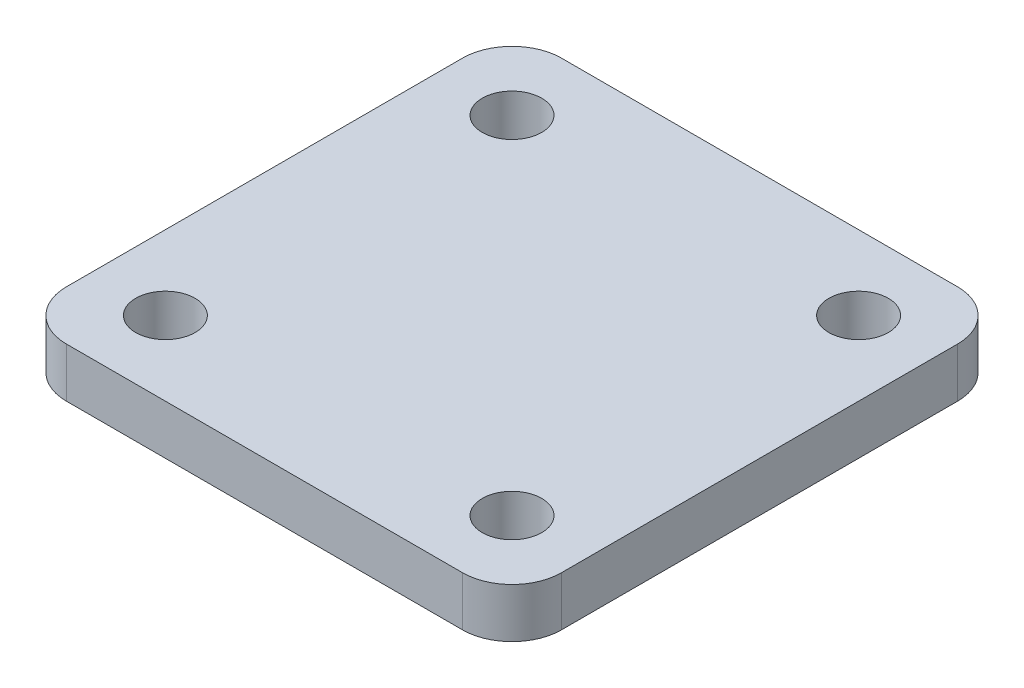
ISO-10303-21;
HEADER;
FILE_DESCRIPTION(('STEP AP214'),'2;1');
FILE_NAME('part.step','',(''),(''),'','','');
FILE_SCHEMA(('AUTOMOTIVE_DESIGN { 1 0 10303 214 1 1 1 1 }'));
ENDSEC;
DATA;
#1=APPLICATION_CONTEXT('core data for automotive mechanical design processes');
#2=APPLICATION_PROTOCOL_DEFINITION('international standard','automotive_design',2000,#1);
#3=PRODUCT_CONTEXT('',#1,'mechanical');
#4=PRODUCT('Part','Part','',(#3));
#5=PRODUCT_RELATED_PRODUCT_CATEGORY('part','',(#4));
#6=PRODUCT_DEFINITION_FORMATION('','',#4);
#7=PRODUCT_DEFINITION_CONTEXT('part definition',#1,'design');
#8=PRODUCT_DEFINITION('design','',#6,#7);
#9=PRODUCT_DEFINITION_SHAPE('','',#8);
#10=(LENGTH_UNIT() NAMED_UNIT(*) SI_UNIT(.MILLI.,.METRE.));
#11=(NAMED_UNIT(*) PLANE_ANGLE_UNIT() SI_UNIT($,.RADIAN.));
#12=(NAMED_UNIT(*) SI_UNIT($,.STERADIAN.) SOLID_ANGLE_UNIT());
#13=UNCERTAINTY_MEASURE_WITH_UNIT(LENGTH_MEASURE(1.E-05),#10,'distance_accuracy_value','');
#14=(GEOMETRIC_REPRESENTATION_CONTEXT(3) GLOBAL_UNCERTAINTY_ASSIGNED_CONTEXT((#13)) GLOBAL_UNIT_ASSIGNED_CONTEXT((#10,
#11,#12)) REPRESENTATION_CONTEXT('',''));
#15=CARTESIAN_POINT('',(0.,0.,0.));
#16=DIRECTION('',(0.,0.,1.));
#17=DIRECTION('',(1.,0.,0.));
#18=AXIS2_PLACEMENT_3D('',#15,#16,#17);
#19=CARTESIAN_POINT('',(-50.,10.,-50.));
#20=DIRECTION('',(0.,1.,0.));
#21=DIRECTION('',(0.,0.,1.));
#22=AXIS2_PLACEMENT_3D('',#19,#20,#21);
#23=PLANE('',#22);
#24=CARTESIAN_POINT('',(-35.,10.,35.));
#25=DIRECTION('',(0.,1.,0.));
#26=DIRECTION('',(0.,0.,1.));
#27=AXIS2_PLACEMENT_3D('',#24,#25,#26);
#28=CIRCLE('',#27,6.);
#29=CARTESIAN_POINT('',(-35.,10.,41.));
#30=VERTEX_POINT('',#29);
#31=EDGE_CURVE('E188',#30,#30,#28,.T.);
#32=ORIENTED_EDGE('',*,*,#31,.F.);
#33=EDGE_LOOP('',(#32));
#34=FACE_BOUND('',#33,.T.);
#35=CARTESIAN_POINT('',(-35.,10.,-35.));
#36=DIRECTION('',(0.,1.,0.));
#37=DIRECTION('',(0.,0.,1.));
#38=AXIS2_PLACEMENT_3D('',#35,#36,#37);
#39=CIRCLE('',#38,6.);
#40=CARTESIAN_POINT('',(-35.,10.,-29.));
#41=VERTEX_POINT('',#40);
#42=EDGE_CURVE('E134',#41,#41,#39,.T.);
#43=ORIENTED_EDGE('',*,*,#42,.F.);
#44=EDGE_LOOP('',(#43));
#45=FACE_BOUND('',#44,.T.);
#46=DIRECTION('',(0.,0.,1.));
#47=VECTOR('',#46,1.);
#48=CARTESIAN_POINT('',(-50.,10.,50.));
#49=LINE('',#48,#47);
#50=CARTESIAN_POINT('',(-50.,10.,-40.));
#51=VERTEX_POINT('',#50);
#52=CARTESIAN_POINT('',(-50.,10.,40.));
#53=VERTEX_POINT('',#52);
#54=EDGE_CURVE('E139',#51,#53,#49,.T.);
#55=ORIENTED_EDGE('',*,*,#54,.T.);
#56=CARTESIAN_POINT('',(-40.,10.,40.));
#57=DIRECTION('',(0.,1.,0.));
#58=DIRECTION('',(0.,0.,1.));
#59=AXIS2_PLACEMENT_3D('',#56,#57,#58);
#60=CIRCLE('',#59,10.);
#61=CARTESIAN_POINT('',(-40.,10.,50.));
#62=VERTEX_POINT('',#61);
#63=EDGE_CURVE('E154',#53,#62,#60,.T.);
#64=ORIENTED_EDGE('',*,*,#63,.T.);
#65=DIRECTION('',(1.,0.,0.));
#66=VECTOR('',#65,1.);
#67=CARTESIAN_POINT('',(50.,10.,50.));
#68=LINE('',#67,#66);
#69=CARTESIAN_POINT('',(40.,10.,50.));
#70=VERTEX_POINT('',#69);
#71=EDGE_CURVE('E121',#62,#70,#68,.T.);
#72=ORIENTED_EDGE('',*,*,#71,.T.);
#73=CARTESIAN_POINT('',(40.,10.,40.));
#74=DIRECTION('',(0.,1.,0.));
#75=DIRECTION('',(0.,0.,1.));
#76=AXIS2_PLACEMENT_3D('',#73,#74,#75);
#77=CIRCLE('',#76,10.);
#78=CARTESIAN_POINT('',(50.,10.,40.));
#79=VERTEX_POINT('',#78);
#80=EDGE_CURVE('E149',#70,#79,#77,.T.);
#81=ORIENTED_EDGE('',*,*,#80,.T.);
#82=DIRECTION('',(0.,0.,-1.));
#83=VECTOR('',#82,1.);
#84=CARTESIAN_POINT('',(50.,10.,50.));
#85=LINE('',#84,#83);
#86=CARTESIAN_POINT('',(50.,10.,-40.));
#87=VERTEX_POINT('',#86);
#88=EDGE_CURVE('E165',#79,#87,#85,.T.);
#89=ORIENTED_EDGE('',*,*,#88,.T.);
#90=CARTESIAN_POINT('',(40.,10.,-40.));
#91=DIRECTION('',(0.,1.,0.));
#92=DIRECTION('',(0.,0.,1.));
#93=AXIS2_PLACEMENT_3D('',#90,#91,#92);
#94=CIRCLE('',#93,10.);
#95=CARTESIAN_POINT('',(40.,10.,-50.));
#96=VERTEX_POINT('',#95);
#97=EDGE_CURVE('E57',#87,#96,#94,.T.);
#98=ORIENTED_EDGE('',*,*,#97,.T.);
#99=DIRECTION('',(-1.,0.,0.));
#100=VECTOR('',#99,1.);
#101=CARTESIAN_POINT('',(50.,10.,-50.));
#102=LINE('',#101,#100);
#103=CARTESIAN_POINT('',(-40.,10.,-50.));
#104=VERTEX_POINT('',#103);
#105=EDGE_CURVE('E140',#96,#104,#102,.T.);
#106=ORIENTED_EDGE('',*,*,#105,.T.);
#107=CARTESIAN_POINT('',(-40.,10.,-40.));
#108=DIRECTION('',(0.,1.,0.));
#109=DIRECTION('',(0.,0.,1.));
#110=AXIS2_PLACEMENT_3D('',#107,#108,#109);
#111=CIRCLE('',#110,10.);
#112=EDGE_CURVE('E152',#104,#51,#111,.T.);
#113=ORIENTED_EDGE('',*,*,#112,.T.);
#114=EDGE_LOOP('',(#55,#64,#72,#81,#89,#98,#106,#113));
#115=FACE_BOUND('',#114,.T.);
#116=CARTESIAN_POINT('',(35.,10.,-35.));
#117=DIRECTION('',(0.,1.,0.));
#118=DIRECTION('',(0.,0.,1.));
#119=AXIS2_PLACEMENT_3D('',#116,#117,#118);
#120=CIRCLE('',#119,5.99999999999999);
#121=CARTESIAN_POINT('',(35.,10.,-29.));
#122=VERTEX_POINT('',#121);
#123=EDGE_CURVE('E182',#122,#122,#120,.T.);
#124=ORIENTED_EDGE('',*,*,#123,.F.);
#125=EDGE_LOOP('',(#124));
#126=FACE_BOUND('',#125,.T.);
#127=CARTESIAN_POINT('',(35.,10.,35.));
#128=DIRECTION('',(0.,1.,0.));
#129=DIRECTION('',(0.,0.,1.));
#130=AXIS2_PLACEMENT_3D('',#127,#128,#129);
#131=CIRCLE('',#130,5.99999999999999);
#132=CARTESIAN_POINT('',(35.,10.,41.));
#133=VERTEX_POINT('',#132);
#134=EDGE_CURVE('E194',#133,#133,#131,.T.);
#135=ORIENTED_EDGE('',*,*,#134,.F.);
#136=EDGE_LOOP('',(#135));
#137=FACE_BOUND('',#136,.T.);
#138=ADVANCED_FACE('F35',(#34,#45,#115,#126,#137),#23,.T.);
#139=CARTESIAN_POINT('',(-50.,0.,-50.));
#140=DIRECTION('',(0.,1.,0.));
#141=DIRECTION('',(0.,0.,1.));
#142=AXIS2_PLACEMENT_3D('',#139,#140,#141);
#143=PLANE('',#142);
#144=CARTESIAN_POINT('',(-35.,0.,35.));
#145=DIRECTION('',(0.,1.,0.));
#146=DIRECTION('',(0.,0.,1.));
#147=AXIS2_PLACEMENT_3D('',#144,#145,#146);
#148=CIRCLE('',#147,6.);
#149=CARTESIAN_POINT('',(-35.,0.,41.));
#150=VERTEX_POINT('',#149);
#151=EDGE_CURVE('E191',#150,#150,#148,.T.);
#152=ORIENTED_EDGE('',*,*,#151,.T.);
#153=EDGE_LOOP('',(#152));
#154=FACE_BOUND('',#153,.T.);
#155=CARTESIAN_POINT('',(-35.,0.,-35.));
#156=DIRECTION('',(0.,1.,0.));
#157=DIRECTION('',(0.,0.,1.));
#158=AXIS2_PLACEMENT_3D('',#155,#156,#157);
#159=CIRCLE('',#158,6.);
#160=CARTESIAN_POINT('',(-35.,0.,-29.));
#161=VERTEX_POINT('',#160);
#162=EDGE_CURVE('E179',#161,#161,#159,.T.);
#163=ORIENTED_EDGE('',*,*,#162,.T.);
#164=EDGE_LOOP('',(#163));
#165=FACE_BOUND('',#164,.T.);
#166=DIRECTION('',(1.,0.,0.));
#167=VECTOR('',#166,1.);
#168=CARTESIAN_POINT('',(50.,0.,50.));
#169=LINE('',#168,#167);
#170=CARTESIAN_POINT('',(-40.,0.,50.));
#171=VERTEX_POINT('',#170);
#172=CARTESIAN_POINT('',(40.,0.,50.));
#173=VERTEX_POINT('',#172);
#174=EDGE_CURVE('E118',#171,#173,#169,.T.);
#175=ORIENTED_EDGE('',*,*,#174,.F.);
#176=CARTESIAN_POINT('',(-40.,0.,40.));
#177=DIRECTION('',(0.,1.,0.));
#178=DIRECTION('',(0.,0.,1.));
#179=AXIS2_PLACEMENT_3D('',#176,#177,#178);
#180=CIRCLE('',#179,10.);
#181=CARTESIAN_POINT('',(-50.,0.,40.));
#182=VERTEX_POINT('',#181);
#183=EDGE_CURVE('E101',#171,#182,#180,.F.);
#184=ORIENTED_EDGE('',*,*,#183,.T.);
#185=DIRECTION('',(0.,0.,1.));
#186=VECTOR('',#185,1.);
#187=CARTESIAN_POINT('',(-50.,0.,50.));
#188=LINE('',#187,#186);
#189=CARTESIAN_POINT('',(-50.,0.,-40.));
#190=VERTEX_POINT('',#189);
#191=EDGE_CURVE('E129',#190,#182,#188,.T.);
#192=ORIENTED_EDGE('',*,*,#191,.F.);
#193=CARTESIAN_POINT('',(-40.,0.,-40.));
#194=DIRECTION('',(0.,1.,0.));
#195=DIRECTION('',(0.,0.,1.));
#196=AXIS2_PLACEMENT_3D('',#193,#194,#195);
#197=CIRCLE('',#196,10.);
#198=CARTESIAN_POINT('',(-40.,0.,-50.));
#199=VERTEX_POINT('',#198);
#200=EDGE_CURVE('E112',#190,#199,#197,.F.);
#201=ORIENTED_EDGE('',*,*,#200,.T.);
#202=DIRECTION('',(-1.,0.,0.));
#203=VECTOR('',#202,1.);
#204=CARTESIAN_POINT('',(50.,0.,-50.));
#205=LINE('',#204,#203);
#206=CARTESIAN_POINT('',(40.,0.,-50.));
#207=VERTEX_POINT('',#206);
#208=EDGE_CURVE('E132',#207,#199,#205,.T.);
#209=ORIENTED_EDGE('',*,*,#208,.F.);
#210=CARTESIAN_POINT('',(40.,0.,-40.));
#211=DIRECTION('',(0.,1.,0.));
#212=DIRECTION('',(0.,0.,1.));
#213=AXIS2_PLACEMENT_3D('',#210,#211,#212);
#214=CIRCLE('',#213,10.);
#215=CARTESIAN_POINT('',(50.,0.,-40.));
#216=VERTEX_POINT('',#215);
#217=EDGE_CURVE('E143',#207,#216,#214,.F.);
#218=ORIENTED_EDGE('',*,*,#217,.T.);
#219=DIRECTION('',(0.,0.,-1.));
#220=VECTOR('',#219,1.);
#221=CARTESIAN_POINT('',(50.,0.,50.));
#222=LINE('',#221,#220);
#223=CARTESIAN_POINT('',(50.,0.,40.));
#224=VERTEX_POINT('',#223);
#225=EDGE_CURVE('E128',#224,#216,#222,.T.);
#226=ORIENTED_EDGE('',*,*,#225,.F.);
#227=CARTESIAN_POINT('',(40.,0.,40.));
#228=DIRECTION('',(0.,1.,0.));
#229=DIRECTION('',(0.,0.,1.));
#230=AXIS2_PLACEMENT_3D('',#227,#228,#229);
#231=CIRCLE('',#230,10.);
#232=EDGE_CURVE('E122',#224,#173,#231,.F.);
#233=ORIENTED_EDGE('',*,*,#232,.T.);
#234=EDGE_LOOP('',(#175,#184,#192,#201,#209,#218,#226,#233));
#235=FACE_BOUND('',#234,.T.);
#236=CARTESIAN_POINT('',(35.,0.,-35.));
#237=DIRECTION('',(0.,1.,0.));
#238=DIRECTION('',(0.,0.,1.));
#239=AXIS2_PLACEMENT_3D('',#236,#237,#238);
#240=CIRCLE('',#239,5.99999999999999);
#241=CARTESIAN_POINT('',(35.,0.,-29.));
#242=VERTEX_POINT('',#241);
#243=EDGE_CURVE('E185',#242,#242,#240,.T.);
#244=ORIENTED_EDGE('',*,*,#243,.T.);
#245=EDGE_LOOP('',(#244));
#246=FACE_BOUND('',#245,.T.);
#247=CARTESIAN_POINT('',(35.,0.,35.));
#248=DIRECTION('',(0.,1.,0.));
#249=DIRECTION('',(0.,0.,1.));
#250=AXIS2_PLACEMENT_3D('',#247,#248,#249);
#251=CIRCLE('',#250,5.99999999999999);
#252=CARTESIAN_POINT('',(35.,0.,41.));
#253=VERTEX_POINT('',#252);
#254=EDGE_CURVE('E197',#253,#253,#251,.T.);
#255=ORIENTED_EDGE('',*,*,#254,.T.);
#256=EDGE_LOOP('',(#255));
#257=FACE_BOUND('',#256,.T.);
#258=ADVANCED_FACE('F125',(#154,#165,#235,#246,#257),#143,.F.);
#259=CARTESIAN_POINT('',(-50.,10.,50.));
#260=DIRECTION('',(1.,0.,0.));
#261=DIRECTION('',(0.,0.,-1.));
#262=AXIS2_PLACEMENT_3D('',#259,#260,#261);
#263=PLANE('',#262);
#264=ORIENTED_EDGE('',*,*,#191,.T.);
#265=DIRECTION('',(0.,-1.,0.));
#266=VECTOR('',#265,1.);
#267=CARTESIAN_POINT('',(-50.,10.,40.));
#268=LINE('',#267,#266);
#269=EDGE_CURVE('E106',#182,#53,#268,.F.);
#270=ORIENTED_EDGE('',*,*,#269,.T.);
#271=ORIENTED_EDGE('',*,*,#54,.F.);
#272=DIRECTION('',(0.,-1.,0.));
#273=VECTOR('',#272,1.);
#274=CARTESIAN_POINT('',(-50.,10.,-40.));
#275=LINE('',#274,#273);
#276=EDGE_CURVE('E111',#51,#190,#275,.T.);
#277=ORIENTED_EDGE('',*,*,#276,.T.);
#278=EDGE_LOOP('',(#264,#270,#271,#277));
#279=FACE_BOUND('',#278,.T.);
#280=ADVANCED_FACE('F212',(#279),#263,.F.);
#281=CARTESIAN_POINT('',(50.,10.,50.));
#282=DIRECTION('',(0.,0.,-1.));
#283=DIRECTION('',(-1.,0.,0.));
#284=AXIS2_PLACEMENT_3D('',#281,#282,#283);
#285=PLANE('',#284);
#286=ORIENTED_EDGE('',*,*,#71,.F.);
#287=DIRECTION('',(0.,-1.,0.));
#288=VECTOR('',#287,1.);
#289=CARTESIAN_POINT('',(-40.,10.,50.));
#290=LINE('',#289,#288);
#291=EDGE_CURVE('E105',#62,#171,#290,.T.);
#292=ORIENTED_EDGE('',*,*,#291,.T.);
#293=ORIENTED_EDGE('',*,*,#174,.T.);
#294=DIRECTION('',(0.,-1.,0.));
#295=VECTOR('',#294,1.);
#296=CARTESIAN_POINT('',(40.,10.,50.));
#297=LINE('',#296,#295);
#298=EDGE_CURVE('E123',#173,#70,#297,.F.);
#299=ORIENTED_EDGE('',*,*,#298,.T.);
#300=EDGE_LOOP('',(#286,#292,#293,#299));
#301=FACE_BOUND('',#300,.T.);
#302=ADVANCED_FACE('F117',(#301),#285,.F.);
#303=CARTESIAN_POINT('',(50.,10.,50.));
#304=DIRECTION('',(-1.,0.,0.));
#305=DIRECTION('',(0.,0.,1.));
#306=AXIS2_PLACEMENT_3D('',#303,#304,#305);
#307=PLANE('',#306);
#308=ORIENTED_EDGE('',*,*,#225,.T.);
#309=DIRECTION('',(0.,-1.,0.));
#310=VECTOR('',#309,1.);
#311=CARTESIAN_POINT('',(50.,10.,-40.));
#312=LINE('',#311,#310);
#313=EDGE_CURVE('E11',#216,#87,#312,.F.);
#314=ORIENTED_EDGE('',*,*,#313,.T.);
#315=ORIENTED_EDGE('',*,*,#88,.F.);
#316=DIRECTION('',(0.,-1.,0.));
#317=VECTOR('',#316,1.);
#318=CARTESIAN_POINT('',(50.,10.,40.));
#319=LINE('',#318,#317);
#320=EDGE_CURVE('E43',#79,#224,#319,.T.);
#321=ORIENTED_EDGE('',*,*,#320,.T.);
#322=EDGE_LOOP('',(#308,#314,#315,#321));
#323=FACE_BOUND('',#322,.T.);
#324=ADVANCED_FACE('F163',(#323),#307,.F.);
#325=CARTESIAN_POINT('',(50.,10.,-50.));
#326=DIRECTION('',(0.,0.,1.));
#327=DIRECTION('',(1.,0.,0.));
#328=AXIS2_PLACEMENT_3D('',#325,#326,#327);
#329=PLANE('',#328);
#330=ORIENTED_EDGE('',*,*,#208,.T.);
#331=DIRECTION('',(0.,-1.,0.));
#332=VECTOR('',#331,1.);
#333=CARTESIAN_POINT('',(-40.,10.,-50.));
#334=LINE('',#333,#332);
#335=EDGE_CURVE('E50',#199,#104,#334,.F.);
#336=ORIENTED_EDGE('',*,*,#335,.T.);
#337=ORIENTED_EDGE('',*,*,#105,.F.);
#338=DIRECTION('',(0.,-1.,0.));
#339=VECTOR('',#338,1.);
#340=CARTESIAN_POINT('',(40.,10.,-50.));
#341=LINE('',#340,#339);
#342=EDGE_CURVE('E156',#96,#207,#341,.T.);
#343=ORIENTED_EDGE('',*,*,#342,.T.);
#344=EDGE_LOOP('',(#330,#336,#337,#343));
#345=FACE_BOUND('',#344,.T.);
#346=ADVANCED_FACE('F172',(#345),#329,.F.);
#347=CARTESIAN_POINT('',(-35.,10.,-35.));
#348=DIRECTION('',(0.,-1.,0.));
#349=DIRECTION('',(0.,0.,-1.));
#350=AXIS2_PLACEMENT_3D('',#347,#348,#349);
#351=CYLINDRICAL_SURFACE('',#350,6.);
#352=ORIENTED_EDGE('',*,*,#42,.T.);
#353=EDGE_LOOP('',(#352));
#354=FACE_BOUND('',#353,.T.);
#355=ORIENTED_EDGE('',*,*,#162,.F.);
#356=EDGE_LOOP('',(#355));
#357=FACE_BOUND('',#356,.T.);
#358=ADVANCED_FACE('F218',(#354,#357),#351,.F.);
#359=CARTESIAN_POINT('',(35.,10.,-35.));
#360=DIRECTION('',(0.,-1.,0.));
#361=DIRECTION('',(0.,0.,-1.));
#362=AXIS2_PLACEMENT_3D('',#359,#360,#361);
#363=CYLINDRICAL_SURFACE('',#362,5.99999999999999);
#364=ORIENTED_EDGE('',*,*,#123,.T.);
#365=EDGE_LOOP('',(#364));
#366=FACE_BOUND('',#365,.T.);
#367=ORIENTED_EDGE('',*,*,#243,.F.);
#368=EDGE_LOOP('',(#367));
#369=FACE_BOUND('',#368,.T.);
#370=ADVANCED_FACE('F246',(#366,#369),#363,.F.);
#371=CARTESIAN_POINT('',(-35.,10.,35.));
#372=DIRECTION('',(0.,-1.,0.));
#373=DIRECTION('',(0.,0.,-1.));
#374=AXIS2_PLACEMENT_3D('',#371,#372,#373);
#375=CYLINDRICAL_SURFACE('',#374,6.);
#376=ORIENTED_EDGE('',*,*,#31,.T.);
#377=EDGE_LOOP('',(#376));
#378=FACE_BOUND('',#377,.T.);
#379=ORIENTED_EDGE('',*,*,#151,.F.);
#380=EDGE_LOOP('',(#379));
#381=FACE_BOUND('',#380,.T.);
#382=ADVANCED_FACE('F249',(#378,#381),#375,.F.);
#383=CARTESIAN_POINT('',(35.,10.,35.));
#384=DIRECTION('',(0.,-1.,0.));
#385=DIRECTION('',(0.,0.,-1.));
#386=AXIS2_PLACEMENT_3D('',#383,#384,#385);
#387=CYLINDRICAL_SURFACE('',#386,5.99999999999999);
#388=ORIENTED_EDGE('',*,*,#134,.T.);
#389=EDGE_LOOP('',(#388));
#390=FACE_BOUND('',#389,.T.);
#391=ORIENTED_EDGE('',*,*,#254,.F.);
#392=EDGE_LOOP('',(#391));
#393=FACE_BOUND('',#392,.T.);
#394=ADVANCED_FACE('F203',(#390,#393),#387,.F.);
#395=CARTESIAN_POINT('',(-40.,10.,40.));
#396=DIRECTION('',(0.,-1.,0.));
#397=DIRECTION('',(0.,0.,-1.));
#398=AXIS2_PLACEMENT_3D('',#395,#396,#397);
#399=CYLINDRICAL_SURFACE('',#398,10.);
#400=ORIENTED_EDGE('',*,*,#63,.F.);
#401=ORIENTED_EDGE('',*,*,#269,.F.);
#402=ORIENTED_EDGE('',*,*,#183,.F.);
#403=ORIENTED_EDGE('',*,*,#291,.F.);
#404=EDGE_LOOP('',(#400,#401,#402,#403));
#405=FACE_BOUND('',#404,.T.);
#406=ADVANCED_FACE('F104',(#405),#399,.T.);
#407=CARTESIAN_POINT('',(-40.,10.,-40.));
#408=DIRECTION('',(0.,-1.,0.));
#409=DIRECTION('',(0.,0.,-1.));
#410=AXIS2_PLACEMENT_3D('',#407,#408,#409);
#411=CYLINDRICAL_SURFACE('',#410,10.);
#412=ORIENTED_EDGE('',*,*,#112,.F.);
#413=ORIENTED_EDGE('',*,*,#335,.F.);
#414=ORIENTED_EDGE('',*,*,#200,.F.);
#415=ORIENTED_EDGE('',*,*,#276,.F.);
#416=EDGE_LOOP('',(#412,#413,#414,#415));
#417=FACE_BOUND('',#416,.T.);
#418=ADVANCED_FACE('F232',(#417),#411,.T.);
#419=CARTESIAN_POINT('',(40.,10.,-40.));
#420=DIRECTION('',(0.,-1.,0.));
#421=DIRECTION('',(0.,0.,-1.));
#422=AXIS2_PLACEMENT_3D('',#419,#420,#421);
#423=CYLINDRICAL_SURFACE('',#422,10.);
#424=ORIENTED_EDGE('',*,*,#97,.F.);
#425=ORIENTED_EDGE('',*,*,#313,.F.);
#426=ORIENTED_EDGE('',*,*,#217,.F.);
#427=ORIENTED_EDGE('',*,*,#342,.F.);
#428=EDGE_LOOP('',(#424,#425,#426,#427));
#429=FACE_BOUND('',#428,.T.);
#430=ADVANCED_FACE('F171',(#429),#423,.T.);
#431=CARTESIAN_POINT('',(40.,10.,40.));
#432=DIRECTION('',(0.,-1.,0.));
#433=DIRECTION('',(0.,0.,-1.));
#434=AXIS2_PLACEMENT_3D('',#431,#432,#433);
#435=CYLINDRICAL_SURFACE('',#434,10.);
#436=ORIENTED_EDGE('',*,*,#80,.F.);
#437=ORIENTED_EDGE('',*,*,#298,.F.);
#438=ORIENTED_EDGE('',*,*,#232,.F.);
#439=ORIENTED_EDGE('',*,*,#320,.F.);
#440=EDGE_LOOP('',(#436,#437,#438,#439));
#441=FACE_BOUND('',#440,.T.);
#442=ADVANCED_FACE('F37',(#441),#435,.T.);
#443=CLOSED_SHELL('',(#138,#258,#280,#302,#324,#346,#358,#370,#382,#394,#406,#418,#430,#442));
#444=MANIFOLD_SOLID_BREP('B2',#443);
#445=ADVANCED_BREP_SHAPE_REPRESENTATION('',(#18,#444),#14);
#446=SHAPE_DEFINITION_REPRESENTATION(#9,#445);
ENDSEC;
END-ISO-10303-21;
